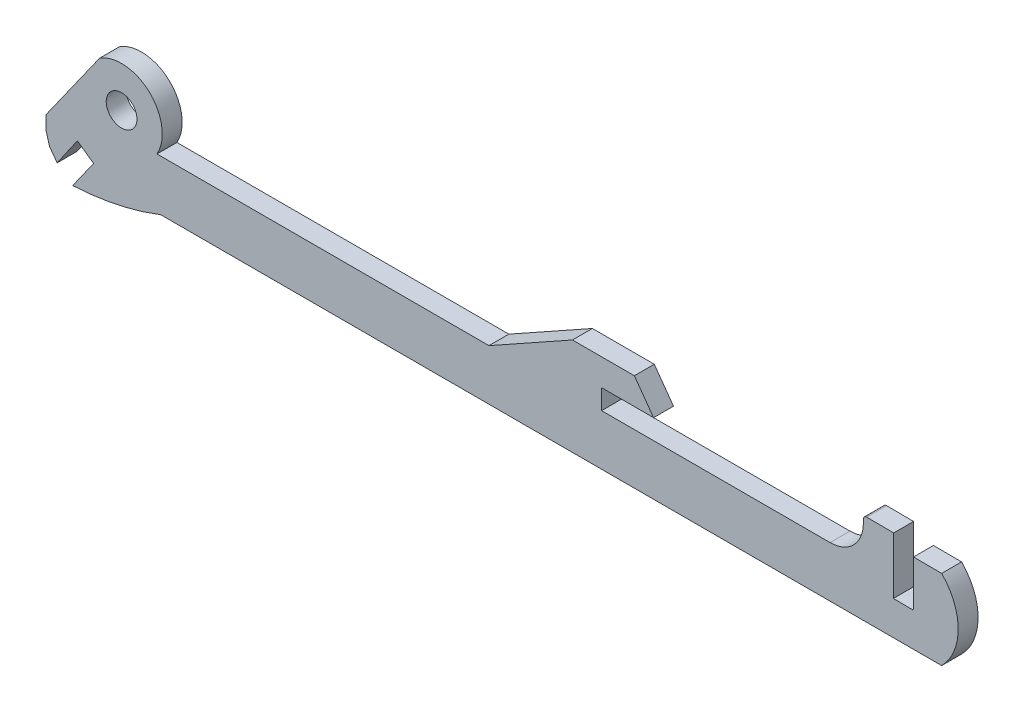
ISO-10303-21;
HEADER;
FILE_DESCRIPTION(('STEP AP214'),'2;1');
FILE_NAME('part.step','',(''),(''),'','','');
FILE_SCHEMA(('AUTOMOTIVE_DESIGN { 1 0 10303 214 1 1 1 1 }'));
ENDSEC;
DATA;
#1=APPLICATION_CONTEXT('core data for automotive mechanical design processes');
#2=APPLICATION_PROTOCOL_DEFINITION('international standard','automotive_design',2000,#1);
#3=PRODUCT_CONTEXT('',#1,'mechanical');
#4=PRODUCT('Part','Part','',(#3));
#5=PRODUCT_RELATED_PRODUCT_CATEGORY('part','',(#4));
#6=PRODUCT_DEFINITION_FORMATION('','',#4);
#7=PRODUCT_DEFINITION_CONTEXT('part definition',#1,'design');
#8=PRODUCT_DEFINITION('design','',#6,#7);
#9=PRODUCT_DEFINITION_SHAPE('','',#8);
#10=(LENGTH_UNIT() NAMED_UNIT(*) SI_UNIT(.MILLI.,.METRE.));
#11=(NAMED_UNIT(*) PLANE_ANGLE_UNIT() SI_UNIT($,.RADIAN.));
#12=(NAMED_UNIT(*) SI_UNIT($,.STERADIAN.) SOLID_ANGLE_UNIT());
#13=UNCERTAINTY_MEASURE_WITH_UNIT(LENGTH_MEASURE(1.E-05),#10,'distance_accuracy_value','');
#14=(GEOMETRIC_REPRESENTATION_CONTEXT(3) GLOBAL_UNCERTAINTY_ASSIGNED_CONTEXT((#13)) GLOBAL_UNIT_ASSIGNED_CONTEXT((#10,
#11,#12)) REPRESENTATION_CONTEXT('',''));
#15=CARTESIAN_POINT('',(0.,0.,0.));
#16=DIRECTION('',(0.,0.,1.));
#17=DIRECTION('',(1.,0.,0.));
#18=AXIS2_PLACEMENT_3D('',#15,#16,#17);
#19=CARTESIAN_POINT('',(1249.29913279827,-100.717822078419,3.));
#20=DIRECTION('',(0.,0.,-1.));
#21=DIRECTION('',(-1.,0.,0.));
#22=AXIS2_PLACEMENT_3D('',#19,#20,#21);
#23=PLANE('',#22);
#24=DIRECTION('',(0.00562127235781514,-0.999984200523728,0.));
#25=VECTOR('',#24,1.);
#26=CARTESIAN_POINT('',(1237.9238014744,-109.055713836434,3.));
#27=LINE('',#26,#25);
#28=CARTESIAN_POINT('',(1237.91205130226,-106.96544214322,3.));
#29=VERTEX_POINT('',#28);
#30=CARTESIAN_POINT('',(1237.9238014744,-109.055713836434,3.));
#31=VERTEX_POINT('',#30);
#32=EDGE_CURVE('E286',#29,#31,#27,.T.);
#33=ORIENTED_EDGE('',*,*,#32,.T.);
#34=DIRECTION('',(0.281544310526475,-0.959548227662462,0.));
#35=VECTOR('',#34,1.);
#36=CARTESIAN_POINT('',(1238.46032272712,-110.884264433615,3.));
#37=LINE('',#36,#35);
#38=CARTESIAN_POINT('',(1238.46032272712,-110.884264433615,3.));
#39=VERTEX_POINT('',#38);
#40=EDGE_CURVE('E225',#31,#39,#37,.T.);
#41=ORIENTED_EDGE('',*,*,#40,.T.);
#42=DIRECTION('',(0.594148336046172,-0.80435549029864,0.));
#43=VECTOR('',#42,1.);
#44=CARTESIAN_POINT('',(1239.59169644422,-112.415913359857,3.));
#45=LINE('',#44,#43);
#46=CARTESIAN_POINT('',(1239.59169644422,-112.415913359857,3.));
#47=VERTEX_POINT('',#46);
#48=EDGE_CURVE('E289',#39,#47,#45,.T.);
#49=ORIENTED_EDGE('',*,*,#48,.T.);
#50=DIRECTION('',(0.568869517770941,0.82242779120787,0.));
#51=VECTOR('',#50,1.);
#52=CARTESIAN_POINT('',(1242.63666962349,-108.013725357363,3.));
#53=LINE('',#52,#51);
#54=CARTESIAN_POINT('',(1242.63666962349,-108.013725357363,3.));
#55=VERTEX_POINT('',#54);
#56=EDGE_CURVE('E291',#47,#55,#53,.T.);
#57=ORIENTED_EDGE('',*,*,#56,.T.);
#58=DIRECTION('',(0.81647452991787,-0.57738145276359,0.));
#59=VECTOR('',#58,1.);
#60=CARTESIAN_POINT('',(1245.08609321325,-109.745869715654,3.));
#61=LINE('',#60,#59);
#62=CARTESIAN_POINT('',(1245.08609321325,-109.745869715654,3.));
#63=VERTEX_POINT('',#62);
#64=EDGE_CURVE('E293',#55,#63,#61,.T.);
#65=ORIENTED_EDGE('',*,*,#64,.T.);
#66=DIRECTION('',(-0.577381452763587,-0.816474529917872,0.));
#67=VECTOR('',#66,1.);
#68=CARTESIAN_POINT('',(1241.93611115172,-114.200256171309,3.));
#69=LINE('',#68,#67);
#70=CARTESIAN_POINT('',(1241.93611115172,-114.200256171309,3.));
#71=VERTEX_POINT('',#70);
#72=EDGE_CURVE('E295',#63,#71,#69,.T.);
#73=ORIENTED_EDGE('',*,*,#72,.T.);
#74=CARTESIAN_POINT('',(1240.12442524358,-73.1446000820579,3.));
#75=DIRECTION('',(0.,0.,1.));
#76=DIRECTION('',(-1.,0.,0.));
#77=AXIS2_PLACEMENT_3D('',#74,#75,#76);
#78=CIRCLE('',#77,41.0956092879595);
#79=CARTESIAN_POINT('',(1255.17955346671,-111.383222140571,3.));
#80=VERTEX_POINT('',#79);
#81=EDGE_CURVE('E297',#71,#80,#78,.T.);
#82=ORIENTED_EDGE('',*,*,#81,.T.);
#83=DIRECTION('',(1.,0.,0.));
#84=VECTOR('',#83,1.);
#85=CARTESIAN_POINT('',(1372.85593511088,-111.383222140572,3.));
#86=LINE('',#85,#84);
#87=CARTESIAN_POINT('',(1372.85593511088,-111.383222140572,3.));
#88=VERTEX_POINT('',#87);
#89=EDGE_CURVE('E299',#80,#88,#86,.T.);
#90=ORIENTED_EDGE('',*,*,#89,.T.);
#91=CARTESIAN_POINT('',(1366.83954740942,-105.36638446055,3.));
#92=DIRECTION('',(0.,0.,1.));
#93=DIRECTION('',(-1.,0.,0.));
#94=AXIS2_PLACEMENT_3D('',#91,#92,#93);
#95=CIRCLE('',#94,8.50877527273733);
#96=CARTESIAN_POINT('',(1372.85638508944,-99.3499967590952,3.));
#97=VERTEX_POINT('',#96);
#98=EDGE_CURVE('E301',#88,#97,#95,.T.);
#99=ORIENTED_EDGE('',*,*,#98,.T.);
#100=DIRECTION('',(-0.999980087028899,0.00631074842440737,0.));
#101=VECTOR('',#100,1.);
#102=CARTESIAN_POINT('',(1368.62014239532,-99.3232623648266,3.));
#103=LINE('',#102,#101);
#104=CARTESIAN_POINT('',(1368.62014239532,-99.3232623648266,3.));
#105=VERTEX_POINT('',#104);
#106=EDGE_CURVE('E303',#97,#105,#103,.T.);
#107=ORIENTED_EDGE('',*,*,#106,.T.);
#108=DIRECTION('',(-0.00631074842441192,-0.999980087028899,0.));
#109=VECTOR('',#108,1.);
#110=CARTESIAN_POINT('',(1368.62014239532,-99.3232623648266,3.));
#111=LINE('',#110,#109);
#112=CARTESIAN_POINT('',(1368.57623781168,-106.280235834852,3.));
#113=VERTEX_POINT('',#112);
#114=EDGE_CURVE('E305',#105,#113,#111,.T.);
#115=ORIENTED_EDGE('',*,*,#114,.T.);
#116=DIRECTION('',(-0.999980087028899,0.00631074842442893,0.));
#117=VECTOR('',#116,1.);
#118=CARTESIAN_POINT('',(1365.57623781168,-106.261303212574,3.));
#119=LINE('',#118,#117);
#120=CARTESIAN_POINT('',(1365.57623781168,-106.261303212574,3.));
#121=VERTEX_POINT('',#120);
#122=EDGE_CURVE('E307',#113,#121,#119,.T.);
#123=ORIENTED_EDGE('',*,*,#122,.T.);
#124=DIRECTION('',(0.0063107484244243,0.999980087028899,0.));
#125=VECTOR('',#124,1.);
#126=CARTESIAN_POINT('',(1365.63036840998,-97.6839496630379,3.));
#127=LINE('',#126,#125);
#128=CARTESIAN_POINT('',(1365.63036840998,-97.6839496630379,3.));
#129=VERTEX_POINT('',#128);
#130=EDGE_CURVE('E309',#121,#129,#127,.T.);
#131=ORIENTED_EDGE('',*,*,#130,.T.);
#132=DIRECTION('',(-0.999980087028899,0.00631074842441902,0.));
#133=VECTOR('',#132,1.);
#134=CARTESIAN_POINT('',(1361.56568395741,-97.6582979512313,3.));
#135=LINE('',#134,#133);
#136=CARTESIAN_POINT('',(1361.56568395741,-97.6582979512312,3.));
#137=VERTEX_POINT('',#136);
#138=EDGE_CURVE('E311',#129,#137,#135,.T.);
#139=ORIENTED_EDGE('',*,*,#138,.T.);
#140=CARTESIAN_POINT('',(1361.5625285832,-98.1582879947458,3.));
#141=DIRECTION('',(0.,0.,1.));
#142=DIRECTION('',(-1.,0.,0.));
#143=AXIS2_PLACEMENT_3D('',#140,#141,#142);
#144=CIRCLE('',#143,0.500000000000082);
#145=CARTESIAN_POINT('',(1361.0625285832,-98.1582879947458,3.));
#146=VERTEX_POINT('',#145);
#147=EDGE_CURVE('E313',#137,#146,#144,.T.);
#148=ORIENTED_EDGE('',*,*,#147,.T.);
#149=DIRECTION('',(0.,-1.,0.));
#150=VECTOR('',#149,1.);
#151=CARTESIAN_POINT('',(1361.0625285832,-98.4776898423774,3.));
#152=LINE('',#151,#150);
#153=CARTESIAN_POINT('',(1361.0625285832,-98.4776898423774,3.));
#154=VERTEX_POINT('',#153);
#155=EDGE_CURVE('E315',#146,#154,#152,.T.);
#156=ORIENTED_EDGE('',*,*,#155,.T.);
#157=DIRECTION('',(-0.0379292699595428,-0.999280426347047,0.));
#158=VECTOR('',#157,1.);
#159=CARTESIAN_POINT('',(1361.04558813768,-98.9240009800915,3.));
#160=LINE('',#159,#158);
#161=CARTESIAN_POINT('',(1361.04558813768,-98.9240009800915,3.));
#162=VERTEX_POINT('',#161);
#163=EDGE_CURVE('E317',#154,#162,#160,.T.);
#164=ORIENTED_EDGE('',*,*,#163,.T.);
#165=CARTESIAN_POINT('',(1356.04918600594,-98.734354630292,3.));
#166=DIRECTION('',(0.,0.,-1.));
#167=DIRECTION('',(1.,0.,0.));
#168=AXIS2_PLACEMENT_3D('',#165,#166,#167);
#169=CIRCLE('',#168,5.00000000000004);
#170=CARTESIAN_POINT('',(1356.04918600594,-103.734354630292,3.));
#171=VERTEX_POINT('',#170);
#172=EDGE_CURVE('E319',#162,#171,#169,.T.);
#173=ORIENTED_EDGE('',*,*,#172,.T.);
#174=DIRECTION('',(-1.,0.,0.));
#175=VECTOR('',#174,1.);
#176=CARTESIAN_POINT('',(1321.62054351915,-103.734354630292,3.));
#177=LINE('',#176,#175);
#178=CARTESIAN_POINT('',(1321.62054351915,-103.734354630292,3.));
#179=VERTEX_POINT('',#178);
#180=EDGE_CURVE('E321',#171,#179,#177,.T.);
#181=ORIENTED_EDGE('',*,*,#180,.T.);
#182=DIRECTION('',(0.,1.,0.));
#183=VECTOR('',#182,1.);
#184=CARTESIAN_POINT('',(1321.62054351915,-100.734354630292,3.));
#185=LINE('',#184,#183);
#186=CARTESIAN_POINT('',(1321.62054351915,-100.734354630292,3.));
#187=VERTEX_POINT('',#186);
#188=EDGE_CURVE('E323',#179,#187,#185,.T.);
#189=ORIENTED_EDGE('',*,*,#188,.T.);
#190=DIRECTION('',(1.,0.,0.));
#191=VECTOR('',#190,1.);
#192=CARTESIAN_POINT('',(1329.4523890128,-100.734354630292,3.));
#193=LINE('',#192,#191);
#194=CARTESIAN_POINT('',(1329.4523890128,-100.734354630292,3.));
#195=VERTEX_POINT('',#194);
#196=EDGE_CURVE('E325',#187,#195,#193,.T.);
#197=ORIENTED_EDGE('',*,*,#196,.T.);
#198=DIRECTION('',(-0.583216661111153,0.812316641588954,0.));
#199=VECTOR('',#198,1.);
#200=CARTESIAN_POINT('',(1326.56081780387,-96.7069123948891,3.));
#201=LINE('',#200,#199);
#202=CARTESIAN_POINT('',(1326.56081780387,-96.7069123948891,3.));
#203=VERTEX_POINT('',#202);
#204=EDGE_CURVE('E327',#195,#203,#201,.T.);
#205=ORIENTED_EDGE('',*,*,#204,.T.);
#206=DIRECTION('',(-1.,0.,0.));
#207=VECTOR('',#206,1.);
#208=CARTESIAN_POINT('',(1317.22732187553,-96.7069123948894,3.));
#209=LINE('',#208,#207);
#210=CARTESIAN_POINT('',(1317.22732187553,-96.7069123948894,3.));
#211=VERTEX_POINT('',#210);
#212=EDGE_CURVE('E329',#203,#211,#209,.T.);
#213=ORIENTED_EDGE('',*,*,#212,.T.);
#214=DIRECTION('',(-0.872913314261698,-0.487875338364892,0.));
#215=VECTOR('',#214,1.);
#216=CARTESIAN_POINT('',(1304.65372487215,-103.734354630292,3.));
#217=LINE('',#216,#215);
#218=CARTESIAN_POINT('',(1304.65372487215,-103.734354630292,3.));
#219=VERTEX_POINT('',#218);
#220=EDGE_CURVE('E331',#211,#219,#217,.T.);
#221=ORIENTED_EDGE('',*,*,#220,.T.);
#222=DIRECTION('',(-1.,0.,0.));
#223=VECTOR('',#222,1.);
#224=CARTESIAN_POINT('',(1254.63436473097,-103.734354630292,3.));
#225=LINE('',#224,#223);
#226=CARTESIAN_POINT('',(1254.63436473097,-103.734354630292,3.));
#227=VERTEX_POINT('',#226);
#228=EDGE_CURVE('E333',#219,#227,#225,.T.);
#229=ORIENTED_EDGE('',*,*,#228,.T.);
#230=CARTESIAN_POINT('',(1249.29913279827,-100.717822078419,3.));
#231=DIRECTION('',(0.,0.,1.));
#232=DIRECTION('',(-1.,0.,0.));
#233=AXIS2_PLACEMENT_3D('',#230,#231,#232);
#234=CIRCLE('',#233,6.12896144646709);
#235=CARTESIAN_POINT('',(1245.98749698581,-95.5605711966088,3.));
#236=VERTEX_POINT('',#235);
#237=EDGE_CURVE('E52',#227,#236,#234,.T.);
#238=ORIENTED_EDGE('',*,*,#237,.T.);
#239=DIRECTION('',(-0.577874160731018,-0.816125881441963,0.));
#240=VECTOR('',#239,1.);
#241=CARTESIAN_POINT('',(1237.91205130226,-106.96544214322,3.));
#242=LINE('',#241,#240);
#243=EDGE_CURVE('E47',#236,#29,#242,.T.);
#244=ORIENTED_EDGE('',*,*,#243,.T.);
#245=EDGE_LOOP('',(#33,#41,#49,#57,#65,#73,#82,#90,#99,#107,#115,#123,#131,#139,#148,#156,#164,
#173,#181,#189,#197,#205,#213,#221,#229,#238,#244));
#246=FACE_BOUND('',#245,.T.);
#247=CARTESIAN_POINT('',(1249.29913279827,-100.717822078419,3.));
#248=DIRECTION('',(0.,0.,1.));
#249=DIRECTION('',(1.,0.,0.));
#250=AXIS2_PLACEMENT_3D('',#247,#248,#249);
#251=CIRCLE('',#250,2.31465382685576);
#252=CARTESIAN_POINT('',(1251.61378662512,-100.717822078419,3.));
#253=VERTEX_POINT('',#252);
#254=EDGE_CURVE('E230',#253,#253,#251,.T.);
#255=ORIENTED_EDGE('',*,*,#254,.F.);
#256=EDGE_LOOP('',(#255));
#257=FACE_BOUND('',#256,.T.);
#258=ADVANCED_FACE('F32',(#246,#257),#23,.F.);
#259=CARTESIAN_POINT('',(1249.29913279827,-100.717822078419,0.));
#260=DIRECTION('',(0.,0.,-1.));
#261=DIRECTION('',(-1.,0.,0.));
#262=AXIS2_PLACEMENT_3D('',#259,#260,#261);
#263=PLANE('',#262);
#264=DIRECTION('',(0.00562127235781514,-0.999984200523728,0.));
#265=VECTOR('',#264,1.);
#266=CARTESIAN_POINT('',(1237.9238014744,-109.055713836434,0.));
#267=LINE('',#266,#265);
#268=CARTESIAN_POINT('',(1237.91205130226,-106.96544214322,0.));
#269=VERTEX_POINT('',#268);
#270=CARTESIAN_POINT('',(1237.9238014744,-109.055713836434,0.));
#271=VERTEX_POINT('',#270);
#272=EDGE_CURVE('E216',#269,#271,#267,.T.);
#273=ORIENTED_EDGE('',*,*,#272,.F.);
#274=DIRECTION('',(-0.577874160731018,-0.816125881441963,0.));
#275=VECTOR('',#274,1.);
#276=CARTESIAN_POINT('',(1237.91205130226,-106.96544214322,0.));
#277=LINE('',#276,#275);
#278=CARTESIAN_POINT('',(1245.98749698581,-95.5605711966088,0.));
#279=VERTEX_POINT('',#278);
#280=EDGE_CURVE('E284',#279,#269,#277,.T.);
#281=ORIENTED_EDGE('',*,*,#280,.F.);
#282=CARTESIAN_POINT('',(1249.29913279827,-100.717822078419,0.));
#283=DIRECTION('',(0.,0.,1.));
#284=DIRECTION('',(-1.,0.,0.));
#285=AXIS2_PLACEMENT_3D('',#282,#283,#284);
#286=CIRCLE('',#285,6.12896144646709);
#287=CARTESIAN_POINT('',(1254.63436473097,-103.734354630292,0.));
#288=VERTEX_POINT('',#287);
#289=EDGE_CURVE('E282',#288,#279,#286,.T.);
#290=ORIENTED_EDGE('',*,*,#289,.F.);
#291=DIRECTION('',(-1.,0.,0.));
#292=VECTOR('',#291,1.);
#293=CARTESIAN_POINT('',(1254.63436473097,-103.734354630292,0.));
#294=LINE('',#293,#292);
#295=CARTESIAN_POINT('',(1304.65372487215,-103.734354630292,0.));
#296=VERTEX_POINT('',#295);
#297=EDGE_CURVE('E280',#296,#288,#294,.T.);
#298=ORIENTED_EDGE('',*,*,#297,.F.);
#299=DIRECTION('',(-0.872913314261698,-0.487875338364892,0.));
#300=VECTOR('',#299,1.);
#301=CARTESIAN_POINT('',(1304.65372487215,-103.734354630292,0.));
#302=LINE('',#301,#300);
#303=CARTESIAN_POINT('',(1317.22732187553,-96.7069123948894,0.));
#304=VERTEX_POINT('',#303);
#305=EDGE_CURVE('E278',#304,#296,#302,.T.);
#306=ORIENTED_EDGE('',*,*,#305,.F.);
#307=DIRECTION('',(-1.,0.,0.));
#308=VECTOR('',#307,1.);
#309=CARTESIAN_POINT('',(1317.22732187553,-96.7069123948894,0.));
#310=LINE('',#309,#308);
#311=CARTESIAN_POINT('',(1326.56081780387,-96.7069123948891,0.));
#312=VERTEX_POINT('',#311);
#313=EDGE_CURVE('E276',#312,#304,#310,.T.);
#314=ORIENTED_EDGE('',*,*,#313,.F.);
#315=DIRECTION('',(-0.583216661111153,0.812316641588954,0.));
#316=VECTOR('',#315,1.);
#317=CARTESIAN_POINT('',(1326.56081780387,-96.7069123948891,0.));
#318=LINE('',#317,#316);
#319=CARTESIAN_POINT('',(1329.4523890128,-100.734354630292,0.));
#320=VERTEX_POINT('',#319);
#321=EDGE_CURVE('E274',#320,#312,#318,.T.);
#322=ORIENTED_EDGE('',*,*,#321,.F.);
#323=DIRECTION('',(1.,0.,0.));
#324=VECTOR('',#323,1.);
#325=CARTESIAN_POINT('',(1329.4523890128,-100.734354630292,0.));
#326=LINE('',#325,#324);
#327=CARTESIAN_POINT('',(1321.62054351915,-100.734354630292,0.));
#328=VERTEX_POINT('',#327);
#329=EDGE_CURVE('E272',#328,#320,#326,.T.);
#330=ORIENTED_EDGE('',*,*,#329,.F.);
#331=DIRECTION('',(0.,1.,0.));
#332=VECTOR('',#331,1.);
#333=CARTESIAN_POINT('',(1321.62054351915,-100.734354630292,0.));
#334=LINE('',#333,#332);
#335=CARTESIAN_POINT('',(1321.62054351915,-103.734354630292,0.));
#336=VERTEX_POINT('',#335);
#337=EDGE_CURVE('E270',#336,#328,#334,.T.);
#338=ORIENTED_EDGE('',*,*,#337,.F.);
#339=DIRECTION('',(-1.,0.,0.));
#340=VECTOR('',#339,1.);
#341=CARTESIAN_POINT('',(1321.62054351915,-103.734354630292,0.));
#342=LINE('',#341,#340);
#343=CARTESIAN_POINT('',(1356.04918600594,-103.734354630292,0.));
#344=VERTEX_POINT('',#343);
#345=EDGE_CURVE('E268',#344,#336,#342,.T.);
#346=ORIENTED_EDGE('',*,*,#345,.F.);
#347=CARTESIAN_POINT('',(1356.04918600594,-98.734354630292,0.));
#348=DIRECTION('',(0.,0.,-1.));
#349=DIRECTION('',(1.,0.,0.));
#350=AXIS2_PLACEMENT_3D('',#347,#348,#349);
#351=CIRCLE('',#350,5.00000000000004);
#352=CARTESIAN_POINT('',(1361.04558813768,-98.9240009800915,0.));
#353=VERTEX_POINT('',#352);
#354=EDGE_CURVE('E266',#353,#344,#351,.T.);
#355=ORIENTED_EDGE('',*,*,#354,.F.);
#356=DIRECTION('',(-0.0379292699595428,-0.999280426347047,0.));
#357=VECTOR('',#356,1.);
#358=CARTESIAN_POINT('',(1361.04558813768,-98.9240009800915,0.));
#359=LINE('',#358,#357);
#360=CARTESIAN_POINT('',(1361.0625285832,-98.4776898423774,0.));
#361=VERTEX_POINT('',#360);
#362=EDGE_CURVE('E264',#361,#353,#359,.T.);
#363=ORIENTED_EDGE('',*,*,#362,.F.);
#364=DIRECTION('',(0.,-1.,0.));
#365=VECTOR('',#364,1.);
#366=CARTESIAN_POINT('',(1361.0625285832,-98.4776898423774,0.));
#367=LINE('',#366,#365);
#368=CARTESIAN_POINT('',(1361.0625285832,-98.1582879947458,0.));
#369=VERTEX_POINT('',#368);
#370=EDGE_CURVE('E262',#369,#361,#367,.T.);
#371=ORIENTED_EDGE('',*,*,#370,.F.);
#372=CARTESIAN_POINT('',(1361.5625285832,-98.1582879947458,0.));
#373=DIRECTION('',(0.,0.,1.));
#374=DIRECTION('',(-1.,0.,0.));
#375=AXIS2_PLACEMENT_3D('',#372,#373,#374);
#376=CIRCLE('',#375,0.500000000000082);
#377=CARTESIAN_POINT('',(1361.56568395741,-97.6582979512312,0.));
#378=VERTEX_POINT('',#377);
#379=EDGE_CURVE('E260',#378,#369,#376,.T.);
#380=ORIENTED_EDGE('',*,*,#379,.F.);
#381=DIRECTION('',(-0.999980087028899,0.00631074842441902,0.));
#382=VECTOR('',#381,1.);
#383=CARTESIAN_POINT('',(1361.56568395741,-97.6582979512313,0.));
#384=LINE('',#383,#382);
#385=CARTESIAN_POINT('',(1365.63036840998,-97.6839496630379,0.));
#386=VERTEX_POINT('',#385);
#387=EDGE_CURVE('E258',#386,#378,#384,.T.);
#388=ORIENTED_EDGE('',*,*,#387,.F.);
#389=DIRECTION('',(0.0063107484244243,0.999980087028899,0.));
#390=VECTOR('',#389,1.);
#391=CARTESIAN_POINT('',(1365.63036840998,-97.6839496630379,0.));
#392=LINE('',#391,#390);
#393=CARTESIAN_POINT('',(1365.57623781168,-106.261303212574,0.));
#394=VERTEX_POINT('',#393);
#395=EDGE_CURVE('E256',#394,#386,#392,.T.);
#396=ORIENTED_EDGE('',*,*,#395,.F.);
#397=DIRECTION('',(-0.999980087028899,0.00631074842442893,0.));
#398=VECTOR('',#397,1.);
#399=CARTESIAN_POINT('',(1365.57623781168,-106.261303212574,0.));
#400=LINE('',#399,#398);
#401=CARTESIAN_POINT('',(1368.57623781168,-106.280235834852,0.));
#402=VERTEX_POINT('',#401);
#403=EDGE_CURVE('E254',#402,#394,#400,.T.);
#404=ORIENTED_EDGE('',*,*,#403,.F.);
#405=DIRECTION('',(-0.00631074842441192,-0.999980087028899,0.));
#406=VECTOR('',#405,1.);
#407=CARTESIAN_POINT('',(1368.62014239532,-99.3232623648266,0.));
#408=LINE('',#407,#406);
#409=CARTESIAN_POINT('',(1368.62014239532,-99.3232623648266,0.));
#410=VERTEX_POINT('',#409);
#411=EDGE_CURVE('E252',#410,#402,#408,.T.);
#412=ORIENTED_EDGE('',*,*,#411,.F.);
#413=DIRECTION('',(-0.999980087028899,0.00631074842440737,0.));
#414=VECTOR('',#413,1.);
#415=CARTESIAN_POINT('',(1368.62014239532,-99.3232623648266,0.));
#416=LINE('',#415,#414);
#417=CARTESIAN_POINT('',(1372.85638508944,-99.3499967590952,0.));
#418=VERTEX_POINT('',#417);
#419=EDGE_CURVE('E250',#418,#410,#416,.T.);
#420=ORIENTED_EDGE('',*,*,#419,.F.);
#421=CARTESIAN_POINT('',(1366.83954740942,-105.36638446055,0.));
#422=DIRECTION('',(0.,0.,1.));
#423=DIRECTION('',(-1.,0.,0.));
#424=AXIS2_PLACEMENT_3D('',#421,#422,#423);
#425=CIRCLE('',#424,8.50877527273733);
#426=CARTESIAN_POINT('',(1372.85593511088,-111.383222140572,0.));
#427=VERTEX_POINT('',#426);
#428=EDGE_CURVE('E248',#427,#418,#425,.T.);
#429=ORIENTED_EDGE('',*,*,#428,.F.);
#430=DIRECTION('',(1.,0.,0.));
#431=VECTOR('',#430,1.);
#432=CARTESIAN_POINT('',(1372.85593511088,-111.383222140572,0.));
#433=LINE('',#432,#431);
#434=CARTESIAN_POINT('',(1255.17955346671,-111.383222140571,0.));
#435=VERTEX_POINT('',#434);
#436=EDGE_CURVE('E246',#435,#427,#433,.T.);
#437=ORIENTED_EDGE('',*,*,#436,.F.);
#438=CARTESIAN_POINT('',(1240.12442524358,-73.1446000820579,0.));
#439=DIRECTION('',(0.,0.,1.));
#440=DIRECTION('',(-1.,0.,0.));
#441=AXIS2_PLACEMENT_3D('',#438,#439,#440);
#442=CIRCLE('',#441,41.0956092879595);
#443=CARTESIAN_POINT('',(1241.93611115172,-114.200256171309,0.));
#444=VERTEX_POINT('',#443);
#445=EDGE_CURVE('E244',#444,#435,#442,.T.);
#446=ORIENTED_EDGE('',*,*,#445,.F.);
#447=DIRECTION('',(-0.577381452763587,-0.816474529917872,0.));
#448=VECTOR('',#447,1.);
#449=CARTESIAN_POINT('',(1241.93611115172,-114.200256171309,0.));
#450=LINE('',#449,#448);
#451=CARTESIAN_POINT('',(1245.08609321325,-109.745869715654,0.));
#452=VERTEX_POINT('',#451);
#453=EDGE_CURVE('E242',#452,#444,#450,.T.);
#454=ORIENTED_EDGE('',*,*,#453,.F.);
#455=DIRECTION('',(0.81647452991787,-0.57738145276359,0.));
#456=VECTOR('',#455,1.);
#457=CARTESIAN_POINT('',(1245.08609321325,-109.745869715654,0.));
#458=LINE('',#457,#456);
#459=CARTESIAN_POINT('',(1242.63666962349,-108.013725357363,0.));
#460=VERTEX_POINT('',#459);
#461=EDGE_CURVE('E240',#460,#452,#458,.T.);
#462=ORIENTED_EDGE('',*,*,#461,.F.);
#463=DIRECTION('',(0.568869517770941,0.82242779120787,0.));
#464=VECTOR('',#463,1.);
#465=CARTESIAN_POINT('',(1242.63666962349,-108.013725357363,0.));
#466=LINE('',#465,#464);
#467=CARTESIAN_POINT('',(1239.59169644422,-112.415913359857,0.));
#468=VERTEX_POINT('',#467);
#469=EDGE_CURVE('E238',#468,#460,#466,.T.);
#470=ORIENTED_EDGE('',*,*,#469,.F.);
#471=DIRECTION('',(0.594148336046172,-0.80435549029864,0.));
#472=VECTOR('',#471,1.);
#473=CARTESIAN_POINT('',(1239.59169644422,-112.415913359857,0.));
#474=LINE('',#473,#472);
#475=CARTESIAN_POINT('',(1238.46032272712,-110.884264433615,0.));
#476=VERTEX_POINT('',#475);
#477=EDGE_CURVE('E218',#476,#468,#474,.T.);
#478=ORIENTED_EDGE('',*,*,#477,.F.);
#479=DIRECTION('',(0.281544310526475,-0.959548227662462,0.));
#480=VECTOR('',#479,1.);
#481=CARTESIAN_POINT('',(1238.46032272712,-110.884264433615,0.));
#482=LINE('',#481,#480);
#483=EDGE_CURVE('E211',#271,#476,#482,.T.);
#484=ORIENTED_EDGE('',*,*,#483,.F.);
#485=EDGE_LOOP('',(#273,#281,#290,#298,#306,#314,#322,#330,#338,#346,#355,#363,#371,#380,#388,
#396,#404,#412,#420,#429,#437,#446,#454,#462,#470,#478,#484));
#486=FACE_BOUND('',#485,.T.);
#487=CARTESIAN_POINT('',(1249.29913279827,-100.717822078419,0.));
#488=DIRECTION('',(0.,0.,1.));
#489=DIRECTION('',(1.,0.,0.));
#490=AXIS2_PLACEMENT_3D('',#487,#488,#489);
#491=CIRCLE('',#490,2.31465382685576);
#492=CARTESIAN_POINT('',(1251.61378662512,-100.717822078419,0.));
#493=VERTEX_POINT('',#492);
#494=EDGE_CURVE('E233',#493,#493,#491,.T.);
#495=ORIENTED_EDGE('',*,*,#494,.T.);
#496=EDGE_LOOP('',(#495));
#497=FACE_BOUND('',#496,.T.);
#498=ADVANCED_FACE('F212',(#486,#497),#263,.T.);
#499=CARTESIAN_POINT('',(1237.9238014744,-109.055713836434,3.));
#500=DIRECTION('',(0.999984200523728,0.00562127235781514,0.));
#501=DIRECTION('',(-0.00562127235781514,0.999984200523728,0.));
#502=AXIS2_PLACEMENT_3D('',#499,#500,#501);
#503=PLANE('',#502);
#504=ORIENTED_EDGE('',*,*,#272,.T.);
#505=DIRECTION('',(0.,0.,-1.));
#506=VECTOR('',#505,1.);
#507=CARTESIAN_POINT('',(1237.9238014744,-109.055713836434,3.));
#508=LINE('',#507,#506);
#509=EDGE_CURVE('E11',#31,#271,#508,.T.);
#510=ORIENTED_EDGE('',*,*,#509,.F.);
#511=ORIENTED_EDGE('',*,*,#32,.F.);
#512=DIRECTION('',(0.,0.,-1.));
#513=VECTOR('',#512,1.);
#514=CARTESIAN_POINT('',(1237.91205130226,-106.96544214322,3.));
#515=LINE('',#514,#513);
#516=EDGE_CURVE('E229',#29,#269,#515,.T.);
#517=ORIENTED_EDGE('',*,*,#516,.T.);
#518=EDGE_LOOP('',(#504,#510,#511,#517));
#519=FACE_BOUND('',#518,.T.);
#520=ADVANCED_FACE('F34',(#519),#503,.F.);
#521=CARTESIAN_POINT('',(1238.46032272712,-110.884264433615,3.));
#522=DIRECTION('',(0.959548227662462,0.281544310526475,0.));
#523=DIRECTION('',(-0.281544310526475,0.959548227662462,0.));
#524=AXIS2_PLACEMENT_3D('',#521,#522,#523);
#525=PLANE('',#524);
#526=ORIENTED_EDGE('',*,*,#483,.T.);
#527=DIRECTION('',(0.,0.,-1.));
#528=VECTOR('',#527,1.);
#529=CARTESIAN_POINT('',(1238.46032272712,-110.884264433615,3.));
#530=LINE('',#529,#528);
#531=EDGE_CURVE('E40',#39,#476,#530,.T.);
#532=ORIENTED_EDGE('',*,*,#531,.F.);
#533=ORIENTED_EDGE('',*,*,#40,.F.);
#534=ORIENTED_EDGE('',*,*,#509,.T.);
#535=EDGE_LOOP('',(#526,#532,#533,#534));
#536=FACE_BOUND('',#535,.T.);
#537=ADVANCED_FACE('F224',(#536),#525,.F.);
#538=CARTESIAN_POINT('',(1239.59169644422,-112.415913359857,3.));
#539=DIRECTION('',(0.80435549029864,0.594148336046172,0.));
#540=DIRECTION('',(-0.594148336046172,0.80435549029864,0.));
#541=AXIS2_PLACEMENT_3D('',#538,#539,#540);
#542=PLANE('',#541);
#543=ORIENTED_EDGE('',*,*,#477,.T.);
#544=DIRECTION('',(0.,0.,-1.));
#545=VECTOR('',#544,1.);
#546=CARTESIAN_POINT('',(1239.59169644422,-112.415913359857,3.));
#547=LINE('',#546,#545);
#548=EDGE_CURVE('E407',#47,#468,#547,.T.);
#549=ORIENTED_EDGE('',*,*,#548,.F.);
#550=ORIENTED_EDGE('',*,*,#48,.F.);
#551=ORIENTED_EDGE('',*,*,#531,.T.);
#552=EDGE_LOOP('',(#543,#549,#550,#551));
#553=FACE_BOUND('',#552,.T.);
#554=ADVANCED_FACE('F411',(#553),#542,.F.);
#555=CARTESIAN_POINT('',(1242.63666962349,-108.013725357363,3.));
#556=DIRECTION('',(-0.822427791207871,0.568869517770941,0.));
#557=DIRECTION('',(-0.568869517770941,-0.822427791207871,0.));
#558=AXIS2_PLACEMENT_3D('',#555,#556,#557);
#559=PLANE('',#558);
#560=ORIENTED_EDGE('',*,*,#469,.T.);
#561=DIRECTION('',(0.,0.,-1.));
#562=VECTOR('',#561,1.);
#563=CARTESIAN_POINT('',(1242.63666962349,-108.013725357363,3.));
#564=LINE('',#563,#562);
#565=EDGE_CURVE('E404',#55,#460,#564,.T.);
#566=ORIENTED_EDGE('',*,*,#565,.F.);
#567=ORIENTED_EDGE('',*,*,#56,.F.);
#568=ORIENTED_EDGE('',*,*,#548,.T.);
#569=EDGE_LOOP('',(#560,#566,#567,#568));
#570=FACE_BOUND('',#569,.T.);
#571=ADVANCED_FACE('F419',(#570),#559,.F.);
#572=CARTESIAN_POINT('',(1245.08609321325,-109.745869715654,3.));
#573=DIRECTION('',(0.57738145276359,0.81647452991787,0.));
#574=DIRECTION('',(-0.81647452991787,0.57738145276359,0.));
#575=AXIS2_PLACEMENT_3D('',#572,#573,#574);
#576=PLANE('',#575);
#577=ORIENTED_EDGE('',*,*,#461,.T.);
#578=DIRECTION('',(0.,0.,-1.));
#579=VECTOR('',#578,1.);
#580=CARTESIAN_POINT('',(1245.08609321325,-109.745869715654,3.));
#581=LINE('',#580,#579);
#582=EDGE_CURVE('E401',#63,#452,#581,.T.);
#583=ORIENTED_EDGE('',*,*,#582,.F.);
#584=ORIENTED_EDGE('',*,*,#64,.F.);
#585=ORIENTED_EDGE('',*,*,#565,.T.);
#586=EDGE_LOOP('',(#577,#583,#584,#585));
#587=FACE_BOUND('',#586,.T.);
#588=ADVANCED_FACE('F422',(#587),#576,.F.);
#589=CARTESIAN_POINT('',(1241.93611115172,-114.200256171309,3.));
#590=DIRECTION('',(0.816474529917872,-0.577381452763587,0.));
#591=DIRECTION('',(0.577381452763587,0.816474529917872,0.));
#592=AXIS2_PLACEMENT_3D('',#589,#590,#591);
#593=PLANE('',#592);
#594=ORIENTED_EDGE('',*,*,#453,.T.);
#595=DIRECTION('',(0.,0.,-1.));
#596=VECTOR('',#595,1.);
#597=CARTESIAN_POINT('',(1241.93611115172,-114.200256171309,3.));
#598=LINE('',#597,#596);
#599=EDGE_CURVE('E398',#71,#444,#598,.T.);
#600=ORIENTED_EDGE('',*,*,#599,.F.);
#601=ORIENTED_EDGE('',*,*,#72,.F.);
#602=ORIENTED_EDGE('',*,*,#582,.T.);
#603=EDGE_LOOP('',(#594,#600,#601,#602));
#604=FACE_BOUND('',#603,.T.);
#605=ADVANCED_FACE('F427',(#604),#593,.F.);
#606=CARTESIAN_POINT('',(1240.12442524358,-73.1446000820579,3.));
#607=DIRECTION('',(0.,0.,-1.));
#608=DIRECTION('',(-1.,0.,0.));
#609=AXIS2_PLACEMENT_3D('',#606,#607,#608);
#610=CYLINDRICAL_SURFACE('',#609,41.0956092879595);
#611=ORIENTED_EDGE('',*,*,#445,.T.);
#612=DIRECTION('',(0.,0.,-1.));
#613=VECTOR('',#612,1.);
#614=CARTESIAN_POINT('',(1255.17955346671,-111.383222140571,3.));
#615=LINE('',#614,#613);
#616=EDGE_CURVE('E395',#80,#435,#615,.T.);
#617=ORIENTED_EDGE('',*,*,#616,.F.);
#618=ORIENTED_EDGE('',*,*,#81,.F.);
#619=ORIENTED_EDGE('',*,*,#599,.T.);
#620=EDGE_LOOP('',(#611,#617,#618,#619));
#621=FACE_BOUND('',#620,.T.);
#622=ADVANCED_FACE('F433',(#621),#610,.T.);
#623=CARTESIAN_POINT('',(1372.85593511088,-111.383222140572,3.));
#624=DIRECTION('',(0.,1.,0.));
#625=DIRECTION('',(-1.,0.,0.));
#626=AXIS2_PLACEMENT_3D('',#623,#624,#625);
#627=PLANE('',#626);
#628=ORIENTED_EDGE('',*,*,#436,.T.);
#629=DIRECTION('',(0.,0.,-1.));
#630=VECTOR('',#629,1.);
#631=CARTESIAN_POINT('',(1372.85593511088,-111.383222140572,3.));
#632=LINE('',#631,#630);
#633=EDGE_CURVE('E392',#88,#427,#632,.T.);
#634=ORIENTED_EDGE('',*,*,#633,.F.);
#635=ORIENTED_EDGE('',*,*,#89,.F.);
#636=ORIENTED_EDGE('',*,*,#616,.T.);
#637=EDGE_LOOP('',(#628,#634,#635,#636));
#638=FACE_BOUND('',#637,.T.);
#639=ADVANCED_FACE('F437',(#638),#627,.F.);
#640=CARTESIAN_POINT('',(1366.83954740942,-105.36638446055,3.));
#641=DIRECTION('',(0.,0.,-1.));
#642=DIRECTION('',(-1.,0.,0.));
#643=AXIS2_PLACEMENT_3D('',#640,#641,#642);
#644=CYLINDRICAL_SURFACE('',#643,8.50877527273733);
#645=ORIENTED_EDGE('',*,*,#428,.T.);
#646=DIRECTION('',(0.,0.,-1.));
#647=VECTOR('',#646,1.);
#648=CARTESIAN_POINT('',(1372.85638508944,-99.3499967590952,3.));
#649=LINE('',#648,#647);
#650=EDGE_CURVE('E389',#97,#418,#649,.T.);
#651=ORIENTED_EDGE('',*,*,#650,.F.);
#652=ORIENTED_EDGE('',*,*,#98,.F.);
#653=ORIENTED_EDGE('',*,*,#633,.T.);
#654=EDGE_LOOP('',(#645,#651,#652,#653));
#655=FACE_BOUND('',#654,.T.);
#656=ADVANCED_FACE('F442',(#655),#644,.T.);
#657=CARTESIAN_POINT('',(1368.62014239532,-99.3232623648266,3.));
#658=DIRECTION('',(-0.00631074842440737,-0.999980087028899,0.));
#659=DIRECTION('',(0.999980087028899,-0.00631074842440738,0.));
#660=AXIS2_PLACEMENT_3D('',#657,#658,#659);
#661=PLANE('',#660);
#662=ORIENTED_EDGE('',*,*,#419,.T.);
#663=DIRECTION('',(0.,0.,-1.));
#664=VECTOR('',#663,1.);
#665=CARTESIAN_POINT('',(1368.62014239532,-99.3232623648266,3.));
#666=LINE('',#665,#664);
#667=EDGE_CURVE('E386',#105,#410,#666,.T.);
#668=ORIENTED_EDGE('',*,*,#667,.F.);
#669=ORIENTED_EDGE('',*,*,#106,.F.);
#670=ORIENTED_EDGE('',*,*,#650,.T.);
#671=EDGE_LOOP('',(#662,#668,#669,#670));
#672=FACE_BOUND('',#671,.T.);
#673=ADVANCED_FACE('F448',(#672),#661,.F.);
#674=CARTESIAN_POINT('',(1368.62014239532,-99.3232623648266,3.));
#675=DIRECTION('',(0.999980087028899,-0.00631074842441192,0.));
#676=DIRECTION('',(0.00631074842441193,0.999980087028899,0.));
#677=AXIS2_PLACEMENT_3D('',#674,#675,#676);
#678=PLANE('',#677);
#679=ORIENTED_EDGE('',*,*,#411,.T.);
#680=DIRECTION('',(0.,0.,-1.));
#681=VECTOR('',#680,1.);
#682=CARTESIAN_POINT('',(1368.57623781168,-106.280235834852,3.));
#683=LINE('',#682,#681);
#684=EDGE_CURVE('E383',#113,#402,#683,.T.);
#685=ORIENTED_EDGE('',*,*,#684,.F.);
#686=ORIENTED_EDGE('',*,*,#114,.F.);
#687=ORIENTED_EDGE('',*,*,#667,.T.);
#688=EDGE_LOOP('',(#679,#685,#686,#687));
#689=FACE_BOUND('',#688,.T.);
#690=ADVANCED_FACE('F452',(#689),#678,.F.);
#691=CARTESIAN_POINT('',(1365.57623781168,-106.261303212574,3.));
#692=DIRECTION('',(-0.00631074842442893,-0.999980087028899,0.));
#693=DIRECTION('',(0.999980087028899,-0.00631074842442893,0.));
#694=AXIS2_PLACEMENT_3D('',#691,#692,#693);
#695=PLANE('',#694);
#696=ORIENTED_EDGE('',*,*,#403,.T.);
#697=DIRECTION('',(0.,0.,-1.));
#698=VECTOR('',#697,1.);
#699=CARTESIAN_POINT('',(1365.57623781168,-106.261303212574,3.));
#700=LINE('',#699,#698);
#701=EDGE_CURVE('E380',#121,#394,#700,.T.);
#702=ORIENTED_EDGE('',*,*,#701,.F.);
#703=ORIENTED_EDGE('',*,*,#122,.F.);
#704=ORIENTED_EDGE('',*,*,#684,.T.);
#705=EDGE_LOOP('',(#696,#702,#703,#704));
#706=FACE_BOUND('',#705,.T.);
#707=ADVANCED_FACE('F457',(#706),#695,.F.);
#708=CARTESIAN_POINT('',(1365.63036840998,-97.6839496630379,3.));
#709=DIRECTION('',(-0.999980087028899,0.0063107484244243,0.));
#710=DIRECTION('',(-0.0063107484244243,-0.999980087028899,0.));
#711=AXIS2_PLACEMENT_3D('',#708,#709,#710);
#712=PLANE('',#711);
#713=ORIENTED_EDGE('',*,*,#395,.T.);
#714=DIRECTION('',(0.,0.,-1.));
#715=VECTOR('',#714,1.);
#716=CARTESIAN_POINT('',(1365.63036840998,-97.6839496630379,3.));
#717=LINE('',#716,#715);
#718=EDGE_CURVE('E377',#129,#386,#717,.T.);
#719=ORIENTED_EDGE('',*,*,#718,.F.);
#720=ORIENTED_EDGE('',*,*,#130,.F.);
#721=ORIENTED_EDGE('',*,*,#701,.T.);
#722=EDGE_LOOP('',(#713,#719,#720,#721));
#723=FACE_BOUND('',#722,.T.);
#724=ADVANCED_FACE('F463',(#723),#712,.F.);
#725=CARTESIAN_POINT('',(1361.56568395741,-97.6582979512313,3.));
#726=DIRECTION('',(-0.00631074842441902,-0.999980087028899,0.));
#727=DIRECTION('',(0.999980087028899,-0.00631074842441902,0.));
#728=AXIS2_PLACEMENT_3D('',#725,#726,#727);
#729=PLANE('',#728);
#730=ORIENTED_EDGE('',*,*,#387,.T.);
#731=DIRECTION('',(0.,0.,-1.));
#732=VECTOR('',#731,1.);
#733=CARTESIAN_POINT('',(1361.56568395741,-97.6582979512312,3.));
#734=LINE('',#733,#732);
#735=EDGE_CURVE('E374',#137,#378,#734,.T.);
#736=ORIENTED_EDGE('',*,*,#735,.F.);
#737=ORIENTED_EDGE('',*,*,#138,.F.);
#738=ORIENTED_EDGE('',*,*,#718,.T.);
#739=EDGE_LOOP('',(#730,#736,#737,#738));
#740=FACE_BOUND('',#739,.T.);
#741=ADVANCED_FACE('F467',(#740),#729,.F.);
#742=CARTESIAN_POINT('',(1361.5625285832,-98.1582879947458,3.));
#743=DIRECTION('',(0.,0.,-1.));
#744=DIRECTION('',(-1.,0.,0.));
#745=AXIS2_PLACEMENT_3D('',#742,#743,#744);
#746=CYLINDRICAL_SURFACE('',#745,0.500000000000082);
#747=ORIENTED_EDGE('',*,*,#379,.T.);
#748=DIRECTION('',(0.,0.,-1.));
#749=VECTOR('',#748,1.);
#750=CARTESIAN_POINT('',(1361.0625285832,-98.1582879947458,3.));
#751=LINE('',#750,#749);
#752=EDGE_CURVE('E371',#146,#369,#751,.T.);
#753=ORIENTED_EDGE('',*,*,#752,.F.);
#754=ORIENTED_EDGE('',*,*,#147,.F.);
#755=ORIENTED_EDGE('',*,*,#735,.T.);
#756=EDGE_LOOP('',(#747,#753,#754,#755));
#757=FACE_BOUND('',#756,.T.);
#758=ADVANCED_FACE('F472',(#757),#746,.T.);
#759=CARTESIAN_POINT('',(1361.0625285832,-98.4776898423774,3.));
#760=DIRECTION('',(1.,0.,0.));
#761=DIRECTION('',(0.,0.,-1.));
#762=AXIS2_PLACEMENT_3D('',#759,#760,#761);
#763=PLANE('',#762);
#764=ORIENTED_EDGE('',*,*,#370,.T.);
#765=DIRECTION('',(0.,0.,-1.));
#766=VECTOR('',#765,1.);
#767=CARTESIAN_POINT('',(1361.0625285832,-98.4776898423774,3.));
#768=LINE('',#767,#766);
#769=EDGE_CURVE('E368',#154,#361,#768,.T.);
#770=ORIENTED_EDGE('',*,*,#769,.F.);
#771=ORIENTED_EDGE('',*,*,#155,.F.);
#772=ORIENTED_EDGE('',*,*,#752,.T.);
#773=EDGE_LOOP('',(#764,#770,#771,#772));
#774=FACE_BOUND('',#773,.T.);
#775=ADVANCED_FACE('F478',(#774),#763,.F.);
#776=CARTESIAN_POINT('',(1361.04558813768,-98.9240009800915,3.));
#777=DIRECTION('',(0.999280426347047,-0.0379292699595428,0.));
#778=DIRECTION('',(0.0379292699595428,0.999280426347047,0.));
#779=AXIS2_PLACEMENT_3D('',#776,#777,#778);
#780=PLANE('',#779);
#781=ORIENTED_EDGE('',*,*,#362,.T.);
#782=DIRECTION('',(0.,0.,-1.));
#783=VECTOR('',#782,1.);
#784=CARTESIAN_POINT('',(1361.04558813768,-98.9240009800915,3.));
#785=LINE('',#784,#783);
#786=EDGE_CURVE('E365',#162,#353,#785,.T.);
#787=ORIENTED_EDGE('',*,*,#786,.F.);
#788=ORIENTED_EDGE('',*,*,#163,.F.);
#789=ORIENTED_EDGE('',*,*,#769,.T.);
#790=EDGE_LOOP('',(#781,#787,#788,#789));
#791=FACE_BOUND('',#790,.T.);
#792=ADVANCED_FACE('F482',(#791),#780,.F.);
#793=CARTESIAN_POINT('',(1356.04918600594,-98.734354630292,3.));
#794=DIRECTION('',(0.,0.,-1.));
#795=DIRECTION('',(-1.,0.,0.));
#796=AXIS2_PLACEMENT_3D('',#793,#794,#795);
#797=CYLINDRICAL_SURFACE('',#796,5.00000000000004);
#798=ORIENTED_EDGE('',*,*,#354,.T.);
#799=DIRECTION('',(0.,0.,-1.));
#800=VECTOR('',#799,1.);
#801=CARTESIAN_POINT('',(1356.04918600594,-103.734354630292,3.));
#802=LINE('',#801,#800);
#803=EDGE_CURVE('E362',#171,#344,#802,.T.);
#804=ORIENTED_EDGE('',*,*,#803,.F.);
#805=ORIENTED_EDGE('',*,*,#172,.F.);
#806=ORIENTED_EDGE('',*,*,#786,.T.);
#807=EDGE_LOOP('',(#798,#804,#805,#806));
#808=FACE_BOUND('',#807,.T.);
#809=ADVANCED_FACE('F487',(#808),#797,.F.);
#810=CARTESIAN_POINT('',(1321.62054351915,-103.734354630292,3.));
#811=DIRECTION('',(0.,-1.,0.));
#812=DIRECTION('',(0.,0.,-1.));
#813=AXIS2_PLACEMENT_3D('',#810,#811,#812);
#814=PLANE('',#813);
#815=ORIENTED_EDGE('',*,*,#345,.T.);
#816=DIRECTION('',(0.,0.,-1.));
#817=VECTOR('',#816,1.);
#818=CARTESIAN_POINT('',(1321.62054351915,-103.734354630292,3.));
#819=LINE('',#818,#817);
#820=EDGE_CURVE('E359',#179,#336,#819,.T.);
#821=ORIENTED_EDGE('',*,*,#820,.F.);
#822=ORIENTED_EDGE('',*,*,#180,.F.);
#823=ORIENTED_EDGE('',*,*,#803,.T.);
#824=EDGE_LOOP('',(#815,#821,#822,#823));
#825=FACE_BOUND('',#824,.T.);
#826=ADVANCED_FACE('F493',(#825),#814,.F.);
#827=CARTESIAN_POINT('',(1321.62054351915,-100.734354630292,3.));
#828=DIRECTION('',(-1.,0.,0.));
#829=DIRECTION('',(0.,0.,1.));
#830=AXIS2_PLACEMENT_3D('',#827,#828,#829);
#831=PLANE('',#830);
#832=ORIENTED_EDGE('',*,*,#337,.T.);
#833=DIRECTION('',(0.,0.,-1.));
#834=VECTOR('',#833,1.);
#835=CARTESIAN_POINT('',(1321.62054351915,-100.734354630292,3.));
#836=LINE('',#835,#834);
#837=EDGE_CURVE('E356',#187,#328,#836,.T.);
#838=ORIENTED_EDGE('',*,*,#837,.F.);
#839=ORIENTED_EDGE('',*,*,#188,.F.);
#840=ORIENTED_EDGE('',*,*,#820,.T.);
#841=EDGE_LOOP('',(#832,#838,#839,#840));
#842=FACE_BOUND('',#841,.T.);
#843=ADVANCED_FACE('F497',(#842),#831,.F.);
#844=CARTESIAN_POINT('',(1329.4523890128,-100.734354630292,3.));
#845=DIRECTION('',(0.,1.,0.));
#846=DIRECTION('',(0.,0.,1.));
#847=AXIS2_PLACEMENT_3D('',#844,#845,#846);
#848=PLANE('',#847);
#849=ORIENTED_EDGE('',*,*,#329,.T.);
#850=DIRECTION('',(0.,0.,-1.));
#851=VECTOR('',#850,1.);
#852=CARTESIAN_POINT('',(1329.4523890128,-100.734354630292,3.));
#853=LINE('',#852,#851);
#854=EDGE_CURVE('E353',#195,#320,#853,.T.);
#855=ORIENTED_EDGE('',*,*,#854,.F.);
#856=ORIENTED_EDGE('',*,*,#196,.F.);
#857=ORIENTED_EDGE('',*,*,#837,.T.);
#858=EDGE_LOOP('',(#849,#855,#856,#857));
#859=FACE_BOUND('',#858,.T.);
#860=ADVANCED_FACE('F502',(#859),#848,.F.);
#861=CARTESIAN_POINT('',(1326.56081780387,-96.7069123948891,3.));
#862=DIRECTION('',(-0.812316641588955,-0.583216661111153,0.));
#863=DIRECTION('',(0.583216661111153,-0.812316641588955,0.));
#864=AXIS2_PLACEMENT_3D('',#861,#862,#863);
#865=PLANE('',#864);
#866=ORIENTED_EDGE('',*,*,#321,.T.);
#867=DIRECTION('',(0.,0.,-1.));
#868=VECTOR('',#867,1.);
#869=CARTESIAN_POINT('',(1326.56081780387,-96.7069123948891,3.));
#870=LINE('',#869,#868);
#871=EDGE_CURVE('E350',#203,#312,#870,.T.);
#872=ORIENTED_EDGE('',*,*,#871,.F.);
#873=ORIENTED_EDGE('',*,*,#204,.F.);
#874=ORIENTED_EDGE('',*,*,#854,.T.);
#875=EDGE_LOOP('',(#866,#872,#873,#874));
#876=FACE_BOUND('',#875,.T.);
#877=ADVANCED_FACE('F508',(#876),#865,.F.);
#878=CARTESIAN_POINT('',(1317.22732187553,-96.7069123948894,3.));
#879=DIRECTION('',(0.,-1.,0.));
#880=DIRECTION('',(1.,0.,0.));
#881=AXIS2_PLACEMENT_3D('',#878,#879,#880);
#882=PLANE('',#881);
#883=ORIENTED_EDGE('',*,*,#313,.T.);
#884=DIRECTION('',(0.,0.,-1.));
#885=VECTOR('',#884,1.);
#886=CARTESIAN_POINT('',(1317.22732187553,-96.7069123948894,3.));
#887=LINE('',#886,#885);
#888=EDGE_CURVE('E347',#211,#304,#887,.T.);
#889=ORIENTED_EDGE('',*,*,#888,.F.);
#890=ORIENTED_EDGE('',*,*,#212,.F.);
#891=ORIENTED_EDGE('',*,*,#871,.T.);
#892=EDGE_LOOP('',(#883,#889,#890,#891));
#893=FACE_BOUND('',#892,.T.);
#894=ADVANCED_FACE('F512',(#893),#882,.F.);
#895=CARTESIAN_POINT('',(1304.65372487215,-103.734354630292,3.));
#896=DIRECTION('',(0.487875338364892,-0.872913314261698,0.));
#897=DIRECTION('',(0.872913314261698,0.487875338364892,0.));
#898=AXIS2_PLACEMENT_3D('',#895,#896,#897);
#899=PLANE('',#898);
#900=ORIENTED_EDGE('',*,*,#305,.T.);
#901=DIRECTION('',(0.,0.,-1.));
#902=VECTOR('',#901,1.);
#903=CARTESIAN_POINT('',(1304.65372487215,-103.734354630292,3.));
#904=LINE('',#903,#902);
#905=EDGE_CURVE('E344',#219,#296,#904,.T.);
#906=ORIENTED_EDGE('',*,*,#905,.F.);
#907=ORIENTED_EDGE('',*,*,#220,.F.);
#908=ORIENTED_EDGE('',*,*,#888,.T.);
#909=EDGE_LOOP('',(#900,#906,#907,#908));
#910=FACE_BOUND('',#909,.T.);
#911=ADVANCED_FACE('F517',(#910),#899,.F.);
#912=CARTESIAN_POINT('',(1254.63436473097,-103.734354630292,3.));
#913=DIRECTION('',(0.,-1.,0.));
#914=DIRECTION('',(1.,0.,0.));
#915=AXIS2_PLACEMENT_3D('',#912,#913,#914);
#916=PLANE('',#915);
#917=ORIENTED_EDGE('',*,*,#297,.T.);
#918=DIRECTION('',(0.,0.,-1.));
#919=VECTOR('',#918,1.);
#920=CARTESIAN_POINT('',(1254.63436473097,-103.734354630292,3.));
#921=LINE('',#920,#919);
#922=EDGE_CURVE('E341',#227,#288,#921,.T.);
#923=ORIENTED_EDGE('',*,*,#922,.F.);
#924=ORIENTED_EDGE('',*,*,#228,.F.);
#925=ORIENTED_EDGE('',*,*,#905,.T.);
#926=EDGE_LOOP('',(#917,#923,#924,#925));
#927=FACE_BOUND('',#926,.T.);
#928=ADVANCED_FACE('F521',(#927),#916,.F.);
#929=CARTESIAN_POINT('',(1249.29913279827,-100.717822078419,3.));
#930=DIRECTION('',(0.,0.,-1.));
#931=DIRECTION('',(-1.,0.,0.));
#932=AXIS2_PLACEMENT_3D('',#929,#930,#931);
#933=CYLINDRICAL_SURFACE('',#932,6.12896144646709);
#934=ORIENTED_EDGE('',*,*,#289,.T.);
#935=DIRECTION('',(0.,0.,-1.));
#936=VECTOR('',#935,1.);
#937=CARTESIAN_POINT('',(1245.98749698581,-95.5605711966088,3.));
#938=LINE('',#937,#936);
#939=EDGE_CURVE('E338',#236,#279,#938,.T.);
#940=ORIENTED_EDGE('',*,*,#939,.F.);
#941=ORIENTED_EDGE('',*,*,#237,.F.);
#942=ORIENTED_EDGE('',*,*,#922,.T.);
#943=EDGE_LOOP('',(#934,#940,#941,#942));
#944=FACE_BOUND('',#943,.T.);
#945=ADVANCED_FACE('F525',(#944),#933,.T.);
#946=CARTESIAN_POINT('',(1237.91205130226,-106.96544214322,3.));
#947=DIRECTION('',(0.816125881441963,-0.577874160731018,0.));
#948=DIRECTION('',(0.577874160731018,0.816125881441963,0.));
#949=AXIS2_PLACEMENT_3D('',#946,#947,#948);
#950=PLANE('',#949);
#951=ORIENTED_EDGE('',*,*,#280,.T.);
#952=ORIENTED_EDGE('',*,*,#516,.F.);
#953=ORIENTED_EDGE('',*,*,#243,.F.);
#954=ORIENTED_EDGE('',*,*,#939,.T.);
#955=EDGE_LOOP('',(#951,#952,#953,#954));
#956=FACE_BOUND('',#955,.T.);
#957=ADVANCED_FACE('F527',(#956),#950,.F.);
#958=CARTESIAN_POINT('',(1249.29913279827,-100.717822078419,3.));
#959=DIRECTION('',(0.,0.,-1.));
#960=DIRECTION('',(-1.,0.,0.));
#961=AXIS2_PLACEMENT_3D('',#958,#959,#960);
#962=CYLINDRICAL_SURFACE('',#961,2.31465382685576);
#963=ORIENTED_EDGE('',*,*,#254,.T.);
#964=EDGE_LOOP('',(#963));
#965=FACE_BOUND('',#964,.T.);
#966=ORIENTED_EDGE('',*,*,#494,.F.);
#967=EDGE_LOOP('',(#966));
#968=FACE_BOUND('',#967,.T.);
#969=ADVANCED_FACE('F529',(#965,#968),#962,.F.);
#970=CLOSED_SHELL('',(#258,#498,#520,#537,#554,#571,#588,#605,#622,#639,#656,#673,#690,#707,
#724,#741,#758,#775,#792,#809,#826,#843,#860,#877,#894,#911,#928,#945,#957,#969));
#971=MANIFOLD_SOLID_BREP('B2',#970);
#972=ADVANCED_BREP_SHAPE_REPRESENTATION('',(#18,#971),#14);
#973=SHAPE_DEFINITION_REPRESENTATION(#9,#972);
ENDSEC;
END-ISO-10303-21;
